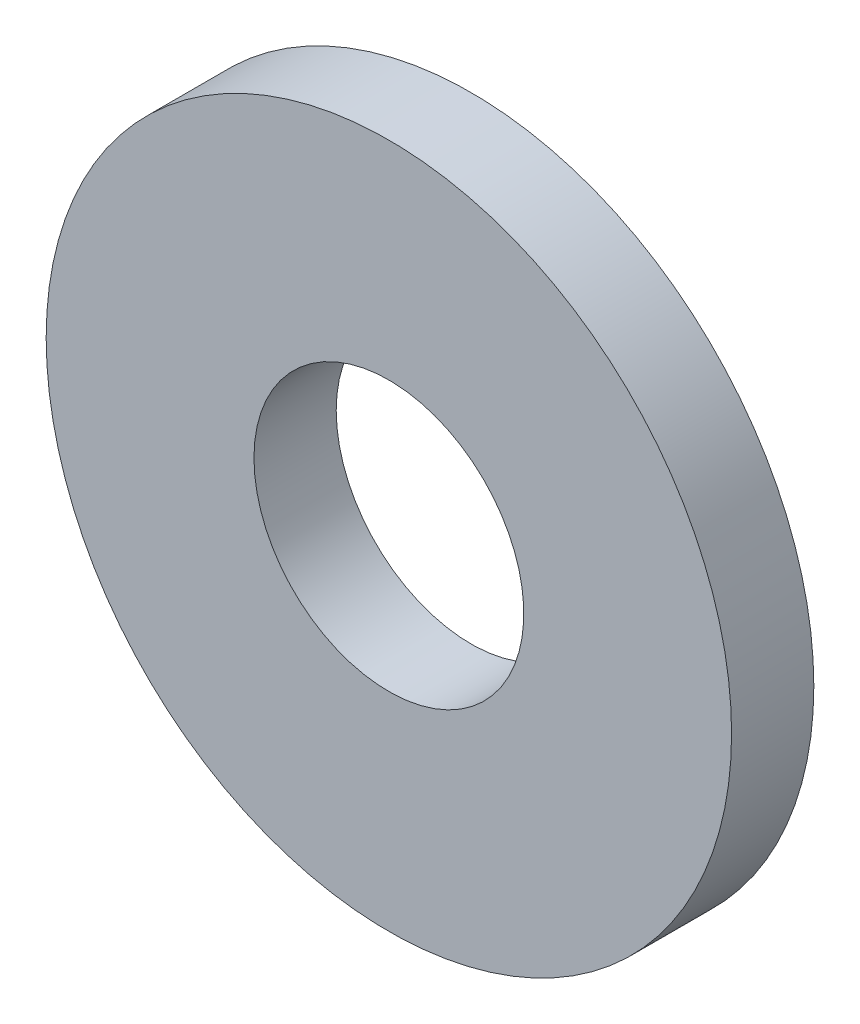
ISO-10303-21;
HEADER;
FILE_DESCRIPTION(('STEP AP214'),'2;1');
FILE_NAME('part.step','',(''),(''),'','','');
FILE_SCHEMA(('AUTOMOTIVE_DESIGN { 1 0 10303 214 1 1 1 1 }'));
ENDSEC;
DATA;
#1=APPLICATION_CONTEXT('core data for automotive mechanical design processes');
#2=APPLICATION_PROTOCOL_DEFINITION('international standard','automotive_design',2000,#1);
#3=PRODUCT_CONTEXT('',#1,'mechanical');
#4=PRODUCT('Part','Part','',(#3));
#5=PRODUCT_RELATED_PRODUCT_CATEGORY('part','',(#4));
#6=PRODUCT_DEFINITION_FORMATION('','',#4);
#7=PRODUCT_DEFINITION_CONTEXT('part definition',#1,'design');
#8=PRODUCT_DEFINITION('design','',#6,#7);
#9=PRODUCT_DEFINITION_SHAPE('','',#8);
#10=(LENGTH_UNIT() NAMED_UNIT(*) SI_UNIT(.MILLI.,.METRE.));
#11=(NAMED_UNIT(*) PLANE_ANGLE_UNIT() SI_UNIT($,.RADIAN.));
#12=(NAMED_UNIT(*) SI_UNIT($,.STERADIAN.) SOLID_ANGLE_UNIT());
#13=UNCERTAINTY_MEASURE_WITH_UNIT(LENGTH_MEASURE(1.E-05),#10,'distance_accuracy_value','');
#14=(GEOMETRIC_REPRESENTATION_CONTEXT(3) GLOBAL_UNCERTAINTY_ASSIGNED_CONTEXT((#13)) GLOBAL_UNIT_ASSIGNED_CONTEXT((#10,
#11,#12)) REPRESENTATION_CONTEXT('',''));
#15=CARTESIAN_POINT('',(0.,0.,0.));
#16=DIRECTION('',(0.,0.,1.));
#17=DIRECTION('',(1.,0.,0.));
#18=AXIS2_PLACEMENT_3D('',#15,#16,#17);
#19=CARTESIAN_POINT('',(0.,0.,1.524));
#20=DIRECTION('',(0.,0.,1.));
#21=DIRECTION('',(1.,0.,0.));
#22=AXIS2_PLACEMENT_3D('',#19,#20,#21);
#23=PLANE('',#22);
#24=CARTESIAN_POINT('',(0.,0.,1.524));
#25=DIRECTION('',(0.,0.,1.));
#26=DIRECTION('',(1.,0.,0.));
#27=AXIS2_PLACEMENT_3D('',#24,#25,#26);
#28=CIRCLE('',#27,6.35);
#29=CARTESIAN_POINT('',(-6.35,0.,1.524));
#30=VERTEX_POINT('',#29);
#31=EDGE_CURVE('E10',#30,#30,#28,.T.);
#32=ORIENTED_EDGE('',*,*,#31,.T.);
#33=EDGE_LOOP('',(#32));
#34=FACE_BOUND('',#33,.T.);
#35=CARTESIAN_POINT('',(0.,0.,1.524));
#36=DIRECTION('',(0.,0.,1.));
#37=DIRECTION('',(1.,0.,0.));
#38=AXIS2_PLACEMENT_3D('',#35,#36,#37);
#39=CIRCLE('',#38,2.5);
#40=CARTESIAN_POINT('',(-2.5,0.,1.524));
#41=VERTEX_POINT('',#40);
#42=EDGE_CURVE('E42',#41,#41,#39,.T.);
#43=ORIENTED_EDGE('',*,*,#42,.F.);
#44=EDGE_LOOP('',(#43));
#45=FACE_BOUND('',#44,.T.);
#46=ADVANCED_FACE('F31',(#34,#45),#23,.T.);
#47=CARTESIAN_POINT('',(0.,0.,0.));
#48=DIRECTION('',(0.,0.,1.));
#49=DIRECTION('',(1.,0.,0.));
#50=AXIS2_PLACEMENT_3D('',#47,#48,#49);
#51=PLANE('',#50);
#52=CARTESIAN_POINT('',(0.,0.,0.));
#53=DIRECTION('',(0.,0.,1.));
#54=DIRECTION('',(1.,0.,0.));
#55=AXIS2_PLACEMENT_3D('',#52,#53,#54);
#56=CIRCLE('',#55,6.35);
#57=CARTESIAN_POINT('',(-6.35,0.,0.));
#58=VERTEX_POINT('',#57);
#59=EDGE_CURVE('E35',#58,#58,#56,.T.);
#60=ORIENTED_EDGE('',*,*,#59,.F.);
#61=EDGE_LOOP('',(#60));
#62=FACE_BOUND('',#61,.T.);
#63=CARTESIAN_POINT('',(0.,0.,0.));
#64=DIRECTION('',(0.,0.,1.));
#65=DIRECTION('',(1.,0.,0.));
#66=AXIS2_PLACEMENT_3D('',#63,#64,#65);
#67=CIRCLE('',#66,2.5);
#68=CARTESIAN_POINT('',(-2.5,0.,0.));
#69=VERTEX_POINT('',#68);
#70=EDGE_CURVE('E44',#69,#69,#67,.T.);
#71=ORIENTED_EDGE('',*,*,#70,.T.);
#72=EDGE_LOOP('',(#71));
#73=FACE_BOUND('',#72,.T.);
#74=ADVANCED_FACE('F54',(#62,#73),#51,.F.);
#75=CARTESIAN_POINT('',(0.,0.,1.524));
#76=DIRECTION('',(0.,0.,-1.));
#77=DIRECTION('',(-1.,0.,0.));
#78=AXIS2_PLACEMENT_3D('',#75,#76,#77);
#79=CYLINDRICAL_SURFACE('',#78,6.35);
#80=CARTESIAN_POINT('',(-6.35,0.,1.524));
#81=CARTESIAN_POINT('',(-6.35,0.,1.508125));
#82=CARTESIAN_POINT('',(-6.35,0.,1.49225));
#83=CARTESIAN_POINT('',(-6.35,0.,1.4605));
#84=CARTESIAN_POINT('',(-6.35,0.,1.444625));
#85=CARTESIAN_POINT('',(-6.35,0.,1.412875));
#86=CARTESIAN_POINT('',(-6.35,0.,1.397));
#87=CARTESIAN_POINT('',(-6.35,0.,1.36525));
#88=CARTESIAN_POINT('',(-6.35,0.,1.349375));
#89=CARTESIAN_POINT('',(-6.35,0.,1.317625));
#90=CARTESIAN_POINT('',(-6.35,0.,1.30175));
#91=CARTESIAN_POINT('',(-6.35,0.,1.27));
#92=CARTESIAN_POINT('',(-6.35,0.,1.254125));
#93=CARTESIAN_POINT('',(-6.35,0.,1.222375));
#94=CARTESIAN_POINT('',(-6.35,0.,1.2065));
#95=CARTESIAN_POINT('',(-6.35,0.,1.17475));
#96=CARTESIAN_POINT('',(-6.35,0.,1.158875));
#97=CARTESIAN_POINT('',(-6.35,0.,1.127125));
#98=CARTESIAN_POINT('',(-6.35,0.,1.11125));
#99=CARTESIAN_POINT('',(-6.35,0.,1.0795));
#100=CARTESIAN_POINT('',(-6.35,0.,1.063625));
#101=CARTESIAN_POINT('',(-6.35,0.,1.031875));
#102=CARTESIAN_POINT('',(-6.35,0.,1.016));
#103=CARTESIAN_POINT('',(-6.35,0.,0.98425));
#104=CARTESIAN_POINT('',(-6.35,0.,0.968375));
#105=CARTESIAN_POINT('',(-6.35,0.,0.936625));
#106=CARTESIAN_POINT('',(-6.35,0.,0.92075));
#107=CARTESIAN_POINT('',(-6.35,0.,0.889));
#108=CARTESIAN_POINT('',(-6.35,0.,0.873125));
#109=CARTESIAN_POINT('',(-6.35,0.,0.841375));
#110=CARTESIAN_POINT('',(-6.35,0.,0.8255));
#111=CARTESIAN_POINT('',(-6.35,0.,0.79375));
#112=CARTESIAN_POINT('',(-6.35,0.,0.777875));
#113=CARTESIAN_POINT('',(-6.35,0.,0.746125));
#114=CARTESIAN_POINT('',(-6.35,0.,0.73025));
#115=CARTESIAN_POINT('',(-6.35,0.,0.6985));
#116=CARTESIAN_POINT('',(-6.35,0.,0.682625));
#117=CARTESIAN_POINT('',(-6.35,0.,0.650875));
#118=CARTESIAN_POINT('',(-6.35,0.,0.635));
#119=CARTESIAN_POINT('',(-6.35,0.,0.60325));
#120=CARTESIAN_POINT('',(-6.35,0.,0.587375));
#121=CARTESIAN_POINT('',(-6.35,0.,0.555625));
#122=CARTESIAN_POINT('',(-6.35,0.,0.53975));
#123=CARTESIAN_POINT('',(-6.35,0.,0.508));
#124=CARTESIAN_POINT('',(-6.35,0.,0.492125));
#125=CARTESIAN_POINT('',(-6.35,0.,0.460375));
#126=CARTESIAN_POINT('',(-6.35,0.,0.4445));
#127=CARTESIAN_POINT('',(-6.35,0.,0.41275));
#128=CARTESIAN_POINT('',(-6.35,0.,0.396875));
#129=CARTESIAN_POINT('',(-6.35,0.,0.365125));
#130=CARTESIAN_POINT('',(-6.35,0.,0.34925));
#131=CARTESIAN_POINT('',(-6.35,0.,0.3175));
#132=CARTESIAN_POINT('',(-6.35,0.,0.301625));
#133=CARTESIAN_POINT('',(-6.35,0.,0.269875));
#134=CARTESIAN_POINT('',(-6.35,0.,0.254));
#135=CARTESIAN_POINT('',(-6.35,0.,0.22225));
#136=CARTESIAN_POINT('',(-6.35,0.,0.206375));
#137=CARTESIAN_POINT('',(-6.35,0.,0.174625));
#138=CARTESIAN_POINT('',(-6.35,0.,0.15875));
#139=CARTESIAN_POINT('',(-6.35,0.,0.127));
#140=CARTESIAN_POINT('',(-6.35,0.,0.111125));
#141=CARTESIAN_POINT('',(-6.35,0.,0.079375));
#142=CARTESIAN_POINT('',(-6.35,0.,0.0635));
#143=CARTESIAN_POINT('',(-6.35,0.,0.0317499999999999));
#144=CARTESIAN_POINT('',(-6.35,0.,0.015875));
#145=CARTESIAN_POINT('',(-6.35,0.,0.));
#146=B_SPLINE_CURVE_WITH_KNOTS('',3,(#80,#81,#82,#83,#84,#85,#86,#87,#88,#89,#90,#91,#92,#93,
#94,#95,#96,#97,#98,#99,#100,#101,#102,#103,#104,#105,#106,#107,#108,#109,#110,#111,#112,#113,
#114,#115,#116,#117,#118,#119,#120,#121,#122,#123,#124,#125,#126,#127,#128,#129,#130,#131,#132,
#133,#134,#135,#136,#137,#138,#139,#140,#141,#142,#143,#144,#145),.UNSPECIFIED.,.F.,.F.,(4,2,2,
2,2,2,2,2,2,2,2,2,2,2,2,2,2,2,2,2,2,2,2,2,2,2,2,2,2,2,2,2,4),(0.,0.0476250000000001,
0.0952500000000001,0.142875,0.1905,0.238125,0.28575,0.333375,0.381,0.428625,0.47625,0.523875,
0.5715,0.619125,0.66675,0.714375,0.762,0.809625,0.85725,0.904875,0.9525,1.000125,1.04775,
1.095375,1.143,1.190625,1.23825,1.285875,1.3335,1.381125,1.42875,1.476375,1.524),.UNSPECIFIED.);
#147=EDGE_CURVE('BSEAM33',#30,#58,#146,.T.);
#148=ORIENTED_EDGE('',*,*,#31,.F.);
#149=ORIENTED_EDGE('',*,*,#59,.T.);
#150=ORIENTED_EDGE('',*,*,#147,.T.);
#151=ORIENTED_EDGE('',*,*,#147,.F.);
#152=EDGE_LOOP('',(#148,#150,#149,#151));
#153=FACE_BOUND('',#152,.T.);
#154=ADVANCED_FACE('F33',(#153),#79,.T.);
#155=CARTESIAN_POINT('',(0.,0.,1.524));
#156=DIRECTION('',(0.,0.,-1.));
#157=DIRECTION('',(-1.,0.,0.));
#158=AXIS2_PLACEMENT_3D('',#155,#156,#157);
#159=CYLINDRICAL_SURFACE('',#158,2.5);
#160=CARTESIAN_POINT('',(-2.5,0.,1.524));
#161=CARTESIAN_POINT('',(-2.5,0.,1.508125));
#162=CARTESIAN_POINT('',(-2.5,0.,1.49225));
#163=CARTESIAN_POINT('',(-2.5,0.,1.4605));
#164=CARTESIAN_POINT('',(-2.5,0.,1.444625));
#165=CARTESIAN_POINT('',(-2.5,0.,1.412875));
#166=CARTESIAN_POINT('',(-2.5,0.,1.397));
#167=CARTESIAN_POINT('',(-2.5,0.,1.36525));
#168=CARTESIAN_POINT('',(-2.5,0.,1.349375));
#169=CARTESIAN_POINT('',(-2.5,0.,1.317625));
#170=CARTESIAN_POINT('',(-2.5,0.,1.30175));
#171=CARTESIAN_POINT('',(-2.5,0.,1.27));
#172=CARTESIAN_POINT('',(-2.5,0.,1.254125));
#173=CARTESIAN_POINT('',(-2.5,0.,1.222375));
#174=CARTESIAN_POINT('',(-2.5,0.,1.2065));
#175=CARTESIAN_POINT('',(-2.5,0.,1.17475));
#176=CARTESIAN_POINT('',(-2.5,0.,1.158875));
#177=CARTESIAN_POINT('',(-2.5,0.,1.127125));
#178=CARTESIAN_POINT('',(-2.5,0.,1.11125));
#179=CARTESIAN_POINT('',(-2.5,0.,1.0795));
#180=CARTESIAN_POINT('',(-2.5,0.,1.063625));
#181=CARTESIAN_POINT('',(-2.5,0.,1.031875));
#182=CARTESIAN_POINT('',(-2.5,0.,1.016));
#183=CARTESIAN_POINT('',(-2.5,0.,0.98425));
#184=CARTESIAN_POINT('',(-2.5,0.,0.968375));
#185=CARTESIAN_POINT('',(-2.5,0.,0.936625));
#186=CARTESIAN_POINT('',(-2.5,0.,0.92075));
#187=CARTESIAN_POINT('',(-2.5,0.,0.889));
#188=CARTESIAN_POINT('',(-2.5,0.,0.873125));
#189=CARTESIAN_POINT('',(-2.5,0.,0.841375));
#190=CARTESIAN_POINT('',(-2.5,0.,0.8255));
#191=CARTESIAN_POINT('',(-2.5,0.,0.79375));
#192=CARTESIAN_POINT('',(-2.5,0.,0.777875));
#193=CARTESIAN_POINT('',(-2.5,0.,0.746125));
#194=CARTESIAN_POINT('',(-2.5,0.,0.73025));
#195=CARTESIAN_POINT('',(-2.5,0.,0.6985));
#196=CARTESIAN_POINT('',(-2.5,0.,0.682625));
#197=CARTESIAN_POINT('',(-2.5,0.,0.650875));
#198=CARTESIAN_POINT('',(-2.5,0.,0.635));
#199=CARTESIAN_POINT('',(-2.5,0.,0.60325));
#200=CARTESIAN_POINT('',(-2.5,0.,0.587375));
#201=CARTESIAN_POINT('',(-2.5,0.,0.555625));
#202=CARTESIAN_POINT('',(-2.5,0.,0.53975));
#203=CARTESIAN_POINT('',(-2.5,0.,0.508));
#204=CARTESIAN_POINT('',(-2.5,0.,0.492125));
#205=CARTESIAN_POINT('',(-2.5,0.,0.460375));
#206=CARTESIAN_POINT('',(-2.5,0.,0.4445));
#207=CARTESIAN_POINT('',(-2.5,0.,0.41275));
#208=CARTESIAN_POINT('',(-2.5,0.,0.396875));
#209=CARTESIAN_POINT('',(-2.5,0.,0.365125));
#210=CARTESIAN_POINT('',(-2.5,0.,0.34925));
#211=CARTESIAN_POINT('',(-2.5,0.,0.3175));
#212=CARTESIAN_POINT('',(-2.5,0.,0.301625));
#213=CARTESIAN_POINT('',(-2.5,0.,0.269875));
#214=CARTESIAN_POINT('',(-2.5,0.,0.254));
#215=CARTESIAN_POINT('',(-2.5,0.,0.22225));
#216=CARTESIAN_POINT('',(-2.5,0.,0.206375));
#217=CARTESIAN_POINT('',(-2.5,0.,0.174625));
#218=CARTESIAN_POINT('',(-2.5,0.,0.15875));
#219=CARTESIAN_POINT('',(-2.5,0.,0.127));
#220=CARTESIAN_POINT('',(-2.5,0.,0.111125));
#221=CARTESIAN_POINT('',(-2.5,0.,0.079375));
#222=CARTESIAN_POINT('',(-2.5,0.,0.0635));
#223=CARTESIAN_POINT('',(-2.5,0.,0.0317499999999999));
#224=CARTESIAN_POINT('',(-2.5,0.,0.015875));
#225=CARTESIAN_POINT('',(-2.5,0.,0.));
#226=B_SPLINE_CURVE_WITH_KNOTS('',3,(#160,#161,#162,#163,#164,#165,#166,#167,#168,#169,#170,
#171,#172,#173,#174,#175,#176,#177,#178,#179,#180,#181,#182,#183,#184,#185,#186,#187,#188,#189,
#190,#191,#192,#193,#194,#195,#196,#197,#198,#199,#200,#201,#202,#203,#204,#205,#206,#207,#208,
#209,#210,#211,#212,#213,#214,#215,#216,#217,#218,#219,#220,#221,#222,#223,#224,#225),
.UNSPECIFIED.,.F.,.F.,(4,2,2,2,2,2,2,2,2,2,2,2,2,2,2,2,2,2,2,2,2,2,2,2,2,2,2,2,2,2,2,2,4),(0.,
0.0476249999999999,0.0952499999999998,0.142875,0.1905,0.238125,0.28575,0.333375,0.381,0.428625,
0.47625,0.523875,0.5715,0.619125,0.66675,0.714375,0.762,0.809625,0.85725,0.904875,0.9525,
1.000125,1.04775,1.095375,1.143,1.190625,1.23825,1.285875,1.3335,1.381125,1.42875,1.476375,
1.524),.UNSPECIFIED.);
#227=EDGE_CURVE('BSEAM50',#41,#69,#226,.T.);
#228=ORIENTED_EDGE('',*,*,#42,.T.);
#229=ORIENTED_EDGE('',*,*,#70,.F.);
#230=ORIENTED_EDGE('',*,*,#227,.T.);
#231=ORIENTED_EDGE('',*,*,#227,.F.);
#232=EDGE_LOOP('',(#228,#230,#229,#231));
#233=FACE_BOUND('',#232,.T.);
#234=ADVANCED_FACE('F50',(#233),#159,.F.);
#235=CLOSED_SHELL('',(#46,#74,#154,#234));
#236=MANIFOLD_SOLID_BREP('B2',#235);
#237=ADVANCED_BREP_SHAPE_REPRESENTATION('',(#18,#236),#14);
#238=SHAPE_DEFINITION_REPRESENTATION(#9,#237);
ENDSEC;
END-ISO-10303-21;
